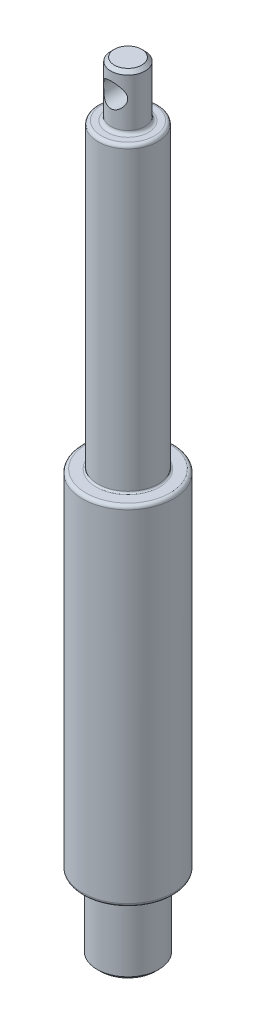
ISO-10303-21;
HEADER;
FILE_DESCRIPTION(('STEP AP214'),'2;1');
FILE_NAME('part.step','',(''),(''),'','','');
FILE_SCHEMA(('AUTOMOTIVE_DESIGN { 1 0 10303 214 1 1 1 1 }'));
ENDSEC;
DATA;
#1=APPLICATION_CONTEXT('core data for automotive mechanical design processes');
#2=APPLICATION_PROTOCOL_DEFINITION('international standard','automotive_design',2000,#1);
#3=PRODUCT_CONTEXT('',#1,'mechanical');
#4=PRODUCT('Part','Part','',(#3));
#5=PRODUCT_RELATED_PRODUCT_CATEGORY('part','',(#4));
#6=PRODUCT_DEFINITION_FORMATION('','',#4);
#7=PRODUCT_DEFINITION_CONTEXT('part definition',#1,'design');
#8=PRODUCT_DEFINITION('design','',#6,#7);
#9=PRODUCT_DEFINITION_SHAPE('','',#8);
#10=(LENGTH_UNIT() NAMED_UNIT(*) SI_UNIT(.MILLI.,.METRE.));
#11=(NAMED_UNIT(*) PLANE_ANGLE_UNIT() SI_UNIT($,.RADIAN.));
#12=(NAMED_UNIT(*) SI_UNIT($,.STERADIAN.) SOLID_ANGLE_UNIT());
#13=UNCERTAINTY_MEASURE_WITH_UNIT(LENGTH_MEASURE(1.E-05),#10,'distance_accuracy_value','');
#14=(GEOMETRIC_REPRESENTATION_CONTEXT(3) GLOBAL_UNCERTAINTY_ASSIGNED_CONTEXT((#13)) GLOBAL_UNIT_ASSIGNED_CONTEXT((#10,
#11,#12)) REPRESENTATION_CONTEXT('',''));
#15=CARTESIAN_POINT('',(0.,0.,0.));
#16=DIRECTION('',(0.,0.,1.));
#17=DIRECTION('',(1.,0.,0.));
#18=AXIS2_PLACEMENT_3D('',#15,#16,#17);
#19=CARTESIAN_POINT('',(0.,0.,0.));
#20=DIRECTION('',(0.,1.,0.));
#21=DIRECTION('',(0.,0.,1.));
#22=AXIS2_PLACEMENT_3D('',#19,#20,#21);
#23=PLANE('',#22);
#24=CARTESIAN_POINT('',(0.,0.,0.));
#25=DIRECTION('',(0.,-1.,0.));
#26=DIRECTION('',(0.,0.,-1.));
#27=AXIS2_PLACEMENT_3D('',#24,#25,#26);
#28=CIRCLE('',#27,5.125);
#29=CARTESIAN_POINT('',(0.,0.,-5.125));
#30=VERTEX_POINT('',#29);
#31=EDGE_CURVE('E70',#30,#30,#28,.T.);
#32=ORIENTED_EDGE('',*,*,#31,.F.);
#33=EDGE_LOOP('',(#32));
#34=FACE_BOUND('',#33,.T.);
#35=CARTESIAN_POINT('',(0.,0.,0.));
#36=DIRECTION('',(0.,1.,0.));
#37=DIRECTION('',(0.,0.,1.));
#38=AXIS2_PLACEMENT_3D('',#35,#36,#37);
#39=CIRCLE('',#38,8.00000000000004);
#40=CARTESIAN_POINT('',(0.,0.,8.00000000000004));
#41=VERTEX_POINT('',#40);
#42=EDGE_CURVE('E148',#41,#41,#39,.F.);
#43=ORIENTED_EDGE('',*,*,#42,.T.);
#44=EDGE_LOOP('',(#43));
#45=FACE_BOUND('',#44,.T.);
#46=ADVANCED_FACE('F49',(#34,#45),#23,.F.);
#47=CARTESIAN_POINT('',(0.,227.,0.));
#48=DIRECTION('',(0.,1.,0.));
#49=DIRECTION('',(0.,0.,1.));
#50=AXIS2_PLACEMENT_3D('',#47,#48,#49);
#51=CYLINDRICAL_SURFACE('',#50,9.);
#52=CARTESIAN_POINT('',(0.,0.999999999999973,0.));
#53=DIRECTION('',(0.,1.,0.));
#54=DIRECTION('',(0.,0.,1.));
#55=AXIS2_PLACEMENT_3D('',#52,#53,#54);
#56=CIRCLE('',#55,9.);
#57=CARTESIAN_POINT('',(0.,0.999999999999973,9.));
#58=VERTEX_POINT('',#57);
#59=EDGE_CURVE('E151',#58,#58,#56,.T.);
#60=ORIENTED_EDGE('',*,*,#59,.T.);
#61=EDGE_LOOP('',(#60));
#62=FACE_BOUND('',#61,.T.);
#63=CARTESIAN_POINT('',(0.,20.5,0.));
#64=DIRECTION('',(0.,1.,0.));
#65=DIRECTION('',(0.,0.,1.));
#66=AXIS2_PLACEMENT_3D('',#63,#64,#65);
#67=CIRCLE('',#66,9.);
#68=CARTESIAN_POINT('',(0.,20.5,9.));
#69=VERTEX_POINT('',#68);
#70=EDGE_CURVE('E200',#69,#69,#67,.F.);
#71=ORIENTED_EDGE('',*,*,#70,.T.);
#72=EDGE_LOOP('',(#71));
#73=FACE_BOUND('',#72,.T.);
#74=ADVANCED_FACE('F106',(#62,#73),#51,.T.);
#75=CARTESIAN_POINT('',(0.,21.5,-9.));
#76=DIRECTION('',(0.,1.,0.));
#77=DIRECTION('',(0.,0.,1.));
#78=AXIS2_PLACEMENT_3D('',#75,#76,#77);
#79=PLANE('',#78);
#80=CARTESIAN_POINT('',(0.,21.5,0.));
#81=DIRECTION('',(0.,1.,0.));
#82=DIRECTION('',(0.,0.,1.));
#83=AXIS2_PLACEMENT_3D('',#80,#81,#82);
#84=CIRCLE('',#83,12.25);
#85=CARTESIAN_POINT('',(0.,21.5,12.25));
#86=VERTEX_POINT('',#85);
#87=EDGE_CURVE('E197',#86,#86,#84,.F.);
#88=ORIENTED_EDGE('',*,*,#87,.T.);
#89=EDGE_LOOP('',(#88));
#90=FACE_BOUND('',#89,.T.);
#91=CARTESIAN_POINT('',(0.,21.5,0.));
#92=DIRECTION('',(0.,1.,0.));
#93=DIRECTION('',(0.,0.,1.));
#94=AXIS2_PLACEMENT_3D('',#91,#92,#93);
#95=CIRCLE('',#94,10.);
#96=CARTESIAN_POINT('',(0.,21.5,10.));
#97=VERTEX_POINT('',#96);
#98=EDGE_CURVE('E194',#97,#97,#95,.T.);
#99=ORIENTED_EDGE('',*,*,#98,.T.);
#100=EDGE_LOOP('',(#99));
#101=FACE_BOUND('',#100,.T.);
#102=ADVANCED_FACE('F112',(#90,#101),#79,.F.);
#103=CARTESIAN_POINT('',(0.,227.,0.));
#104=DIRECTION('',(0.,1.,0.));
#105=DIRECTION('',(0.,0.,1.));
#106=AXIS2_PLACEMENT_3D('',#103,#104,#105);
#107=CYLINDRICAL_SURFACE('',#106,13.25);
#108=CARTESIAN_POINT('',(0.,122.,0.));
#109=DIRECTION('',(0.,-1.,0.));
#110=DIRECTION('',(0.,0.,-1.));
#111=AXIS2_PLACEMENT_3D('',#108,#109,#110);
#112=CIRCLE('',#111,13.25);
#113=CARTESIAN_POINT('',(0.,122.,-13.25));
#114=VERTEX_POINT('',#113);
#115=EDGE_CURVE('E185',#114,#114,#112,.T.);
#116=ORIENTED_EDGE('',*,*,#115,.T.);
#117=EDGE_LOOP('',(#116));
#118=FACE_BOUND('',#117,.T.);
#119=CARTESIAN_POINT('',(0.,22.5,0.));
#120=DIRECTION('',(0.,1.,0.));
#121=DIRECTION('',(0.,0.,1.));
#122=AXIS2_PLACEMENT_3D('',#119,#120,#121);
#123=CIRCLE('',#122,13.25);
#124=CARTESIAN_POINT('',(0.,22.5,13.25));
#125=VERTEX_POINT('',#124);
#126=EDGE_CURVE('E181',#125,#125,#123,.T.);
#127=ORIENTED_EDGE('',*,*,#126,.T.);
#128=EDGE_LOOP('',(#127));
#129=FACE_BOUND('',#128,.T.);
#130=ADVANCED_FACE('F175',(#118,#129),#107,.T.);
#131=CARTESIAN_POINT('',(0.,123.,-13.25));
#132=DIRECTION('',(0.,-1.,0.));
#133=DIRECTION('',(0.,0.,-1.));
#134=AXIS2_PLACEMENT_3D('',#131,#132,#133);
#135=PLANE('',#134);
#136=CARTESIAN_POINT('',(0.,123.,0.));
#137=DIRECTION('',(0.,-1.,0.));
#138=DIRECTION('',(0.,0.,-1.));
#139=AXIS2_PLACEMENT_3D('',#136,#137,#138);
#140=CIRCLE('',#139,9.25000000000002);
#141=CARTESIAN_POINT('',(0.,123.,-9.25000000000002));
#142=VERTEX_POINT('',#141);
#143=EDGE_CURVE('E13',#142,#142,#140,.T.);
#144=ORIENTED_EDGE('',*,*,#143,.T.);
#145=EDGE_LOOP('',(#144));
#146=FACE_BOUND('',#145,.T.);
#147=CARTESIAN_POINT('',(0.,123.,0.));
#148=DIRECTION('',(0.,-1.,0.));
#149=DIRECTION('',(0.,0.,-1.));
#150=AXIS2_PLACEMENT_3D('',#147,#148,#149);
#151=CIRCLE('',#150,12.25);
#152=CARTESIAN_POINT('',(0.,123.,-12.25));
#153=VERTEX_POINT('',#152);
#154=EDGE_CURVE('E179',#153,#153,#151,.F.);
#155=ORIENTED_EDGE('',*,*,#154,.T.);
#156=EDGE_LOOP('',(#155));
#157=FACE_BOUND('',#156,.T.);
#158=ADVANCED_FACE('F172',(#146,#157),#135,.F.);
#159=CARTESIAN_POINT('',(0.,227.,0.));
#160=DIRECTION('',(0.,1.,0.));
#161=DIRECTION('',(0.,0.,1.));
#162=AXIS2_PLACEMENT_3D('',#159,#160,#161);
#163=CYLINDRICAL_SURFACE('',#162,8.75000000000001);
#164=CARTESIAN_POINT('',(0.,123.5,0.));
#165=DIRECTION('',(0.,-1.,0.));
#166=DIRECTION('',(0.,0.,-1.));
#167=AXIS2_PLACEMENT_3D('',#164,#165,#166);
#168=CIRCLE('',#167,8.75000000000001);
#169=CARTESIAN_POINT('',(0.,123.5,-8.75000000000001));
#170=VERTEX_POINT('',#169);
#171=EDGE_CURVE('E56',#170,#170,#168,.F.);
#172=ORIENTED_EDGE('',*,*,#171,.T.);
#173=EDGE_LOOP('',(#172));
#174=FACE_BOUND('',#173,.T.);
#175=CARTESIAN_POINT('',(0.,210.,0.));
#176=DIRECTION('',(0.,-1.,0.));
#177=DIRECTION('',(0.,0.,-1.));
#178=AXIS2_PLACEMENT_3D('',#175,#176,#177);
#179=CIRCLE('',#178,8.75000000000001);
#180=CARTESIAN_POINT('',(0.,210.,-8.75000000000001));
#181=VERTEX_POINT('',#180);
#182=EDGE_CURVE('E182',#181,#181,#179,.T.);
#183=ORIENTED_EDGE('',*,*,#182,.T.);
#184=EDGE_LOOP('',(#183));
#185=FACE_BOUND('',#184,.T.);
#186=ADVANCED_FACE('F162',(#174,#185),#163,.T.);
#187=CARTESIAN_POINT('',(0.,211.,-8.75000000000001));
#188=DIRECTION('',(0.,-1.,0.));
#189=DIRECTION('',(0.,0.,-1.));
#190=AXIS2_PLACEMENT_3D('',#187,#188,#189);
#191=PLANE('',#190);
#192=CARTESIAN_POINT('',(0.,211.,0.));
#193=DIRECTION('',(0.,-1.,0.));
#194=DIRECTION('',(0.,0.,-1.));
#195=AXIS2_PLACEMENT_3D('',#192,#193,#194);
#196=CIRCLE('',#195,6.);
#197=CARTESIAN_POINT('',(0.,211.,-6.));
#198=VERTEX_POINT('',#197);
#199=EDGE_CURVE('E152',#198,#198,#196,.T.);
#200=ORIENTED_EDGE('',*,*,#199,.T.);
#201=EDGE_LOOP('',(#200));
#202=FACE_BOUND('',#201,.T.);
#203=CARTESIAN_POINT('',(0.,211.,0.));
#204=DIRECTION('',(0.,-1.,0.));
#205=DIRECTION('',(0.,0.,-1.));
#206=AXIS2_PLACEMENT_3D('',#203,#204,#205);
#207=CIRCLE('',#206,7.75000000000002);
#208=CARTESIAN_POINT('',(0.,211.,-7.75000000000002));
#209=VERTEX_POINT('',#208);
#210=EDGE_CURVE('E188',#209,#209,#207,.F.);
#211=ORIENTED_EDGE('',*,*,#210,.T.);
#212=EDGE_LOOP('',(#211));
#213=FACE_BOUND('',#212,.T.);
#214=ADVANCED_FACE('F102',(#202,#213),#191,.F.);
#215=CARTESIAN_POINT('',(0.,227.,0.));
#216=DIRECTION('',(0.,1.,0.));
#217=DIRECTION('',(0.,0.,1.));
#218=AXIS2_PLACEMENT_3D('',#215,#216,#217);
#219=CYLINDRICAL_SURFACE('',#218,5.);
#220=CARTESIAN_POINT('',(0.,212.,0.));
#221=DIRECTION('',(0.,-1.,0.));
#222=DIRECTION('',(0.,0.,-1.));
#223=AXIS2_PLACEMENT_3D('',#220,#221,#222);
#224=CIRCLE('',#223,5.);
#225=CARTESIAN_POINT('',(0.,212.,-5.));
#226=VERTEX_POINT('',#225);
#227=EDGE_CURVE('E156',#226,#226,#224,.F.);
#228=ORIENTED_EDGE('',*,*,#227,.T.);
#229=EDGE_LOOP('',(#228));
#230=FACE_BOUND('',#229,.T.);
#231=CARTESIAN_POINT('',(0.,226.,0.));
#232=DIRECTION('',(0.,-1.,0.));
#233=DIRECTION('',(0.,0.,-1.));
#234=AXIS2_PLACEMENT_3D('',#231,#232,#233);
#235=CIRCLE('',#234,5.);
#236=CARTESIAN_POINT('',(0.,226.,-5.));
#237=VERTEX_POINT('',#236);
#238=EDGE_CURVE('E209',#237,#237,#235,.T.);
#239=ORIENTED_EDGE('',*,*,#238,.T.);
#240=EDGE_LOOP('',(#239));
#241=FACE_BOUND('',#240,.T.);
#242=CARTESIAN_POINT('',(0.,216.5,5.));
#243=CARTESIAN_POINT('',(-0.0870043522183536,216.499999551234,5.00000042621704));
#244=CARTESIAN_POINT('',(-0.17400301283471,216.50324846695,4.99772447045084));
#245=CARTESIAN_POINT('',(-0.347314194586731,216.516190784067,4.98867770301692));
#246=CARTESIAN_POINT('',(-0.433626465698286,216.525886433897,4.98190532313284));
#247=CARTESIAN_POINT('',(-0.604838270775731,216.551571331186,4.96402806677404));
#248=CARTESIAN_POINT('',(-0.689738047132317,216.567559486966,4.95292394181202));
#249=CARTESIAN_POINT('',(-0.857541615637311,216.605587236717,4.92664718548648));
#250=CARTESIAN_POINT('',(-0.940444537032614,216.62762942046,4.91147281303201));
#251=CARTESIAN_POINT('',(-1.18445169780014,216.70214746913,4.86050384715948));
#252=CARTESIAN_POINT('',(-1.34188511202347,216.763174157,4.81914978198123));
#253=CARTESIAN_POINT('',(-1.64342226800416,216.905322082246,4.7248504210069));
#254=CARTESIAN_POINT('',(-1.78752406033637,216.986446252032,4.67190343382707));
#255=CARTESIAN_POINT('',(-2.0728188359913,217.174207793629,4.55294999672667));
#256=CARTESIAN_POINT('',(-2.21263077144972,217.282465722956,4.48620313255133));
#257=CARTESIAN_POINT('',(-2.47340994772193,217.517435956797,4.34787986703411));
#258=CARTESIAN_POINT('',(-2.59434841313185,217.64417588164,4.27629632500927));
#259=CARTESIAN_POINT('',(-2.7704332182586,217.85867945549,4.16301906437412));
#260=CARTESIAN_POINT('',(-2.83217300660939,217.941018306532,4.12114814248979));
#261=CARTESIAN_POINT('',(-2.94845109279401,218.111275393595,4.03877741040551));
#262=CARTESIAN_POINT('',(-3.00298752227157,218.199195068411,3.99827795794519));
#263=CARTESIAN_POINT('',(-3.15511672851824,218.470879099042,3.88091849381853));
#264=CARTESIAN_POINT('',(-3.24158145123197,218.662994400224,3.80795944870695));
#265=CARTESIAN_POINT('',(-3.3583150253545,219.003385494197,3.70483812483702));
#266=CARTESIAN_POINT('',(-3.39769929206986,219.146667143814,3.66842434173771));
#267=CARTESIAN_POINT('',(-3.45814142842494,219.440021722513,3.61151026705735));
#268=CARTESIAN_POINT('',(-3.47923517471287,219.590080746465,3.59097883101039));
#269=CARTESIAN_POINT('',(-3.5017263031474,219.893995514556,3.56906148275634));
#270=CARTESIAN_POINT('',(-3.50301074075767,220.047868023526,3.567785357308));
#271=CARTESIAN_POINT('',(-3.48547905206289,220.353393058977,3.58490716922728));
#272=CARTESIAN_POINT('',(-3.46664910102171,220.505043985886,3.60331863800168));
#273=CARTESIAN_POINT('',(-3.41217455094726,220.791827997321,3.65490422743524));
#274=CARTESIAN_POINT('',(-3.37772210034563,220.92739060296,3.68702349344459));
#275=CARTESIAN_POINT('',(-3.29410841442846,221.190787298394,3.76191452361165));
#276=CARTESIAN_POINT('',(-3.24493538684718,221.318615092975,3.80469482342136));
#277=CARTESIAN_POINT('',(-3.10362288773557,221.631130358571,3.92170358258721));
#278=CARTESIAN_POINT('',(-3.00252401271626,221.810045700101,4.00058241582139));
#279=CARTESIAN_POINT('',(-2.77217358887503,222.146324849936,4.16353835198788));
#280=CARTESIAN_POINT('',(-2.64286478640498,222.303643753395,4.24762577382758));
#281=CARTESIAN_POINT('',(-2.35615009551434,222.596341477384,4.41319719993648));
#282=CARTESIAN_POINT('',(-2.19842810008493,222.731436868213,4.4946383043019));
#283=CARTESIAN_POINT('',(-1.85792737623164,222.97347162477,4.64571074856641));
#284=CARTESIAN_POINT('',(-1.67520180814525,223.080469356795,4.71536646098568));
#285=CARTESIAN_POINT('',(-1.33103347938948,223.241300414522,4.82216631911688));
#286=CARTESIAN_POINT('',(-1.1738132378219,223.301657347756,4.86309351042244));
#287=CARTESIAN_POINT('',(-0.849391818622302,223.399584431341,4.93010011584662));
#288=CARTESIAN_POINT('',(-0.682197524634532,223.437170102043,4.95618964221846));
#289=CARTESIAN_POINT('',(-0.341601582307168,223.487556300423,4.99126408812027));
#290=CARTESIAN_POINT('',(-0.168177620339743,223.500256264493,5.00017960470658));
#291=CARTESIAN_POINT('',(0.178615477776662,223.499735953508,4.99981494790605));
#292=CARTESIAN_POINT('',(0.351984616048755,223.486516849556,4.9905355966193));
#293=CARTESIAN_POINT('',(0.681878691052509,223.436722828532,4.95588308246294));
#294=CARTESIAN_POINT('',(0.838764541823742,223.401728333682,4.93159966844544));
#295=CARTESIAN_POINT('',(1.14387617411524,223.311626699332,4.86988673925567));
#296=CARTESIAN_POINT('',(1.29210033422858,223.256515808089,4.83245477190367));
#297=CARTESIAN_POINT('',(1.58733800015483,223.123841485577,4.74402407105279));
#298=CARTESIAN_POINT('',(1.73352523808016,223.044966278017,4.6922533534956));
#299=CARTESIAN_POINT('',(2.01106205302746,222.869259458801,4.58018246824007));
#300=CARTESIAN_POINT('',(2.14240222019468,222.772416561034,4.519876945222));
#301=CARTESIAN_POINT('',(2.41023390883481,222.544939582541,4.38372102498776));
#302=CARTESIAN_POINT('',(2.54376778669954,222.411359026569,4.3069755936636));
#303=CARTESIAN_POINT('',(2.78779809474491,222.124542791527,4.15319019961225));
#304=CARTESIAN_POINT('',(2.89827626990346,221.971291691614,4.07615005231013));
#305=CARTESIAN_POINT('',(3.08500748122275,221.661977469913,3.93636847825756));
#306=CARTESIAN_POINT('',(3.16352422284574,221.507587432333,3.87296424128965));
#307=CARTESIAN_POINT('',(3.29796239328926,221.184844770458,3.75915149445727));
#308=CARTESIAN_POINT('',(3.35392797233401,221.016520213825,3.70871766214843));
#309=CARTESIAN_POINT('',(3.43149310287238,220.703765430281,3.63690600243932));
#310=CARTESIAN_POINT('',(3.45775440021169,220.561389757365,3.61171423380861));
#311=CARTESIAN_POINT('',(3.49238830513131,220.272586577634,3.57824517387987));
#312=CARTESIAN_POINT('',(3.50078409856962,220.1261645726,3.56994596002657));
#313=CARTESIAN_POINT('',(3.49909888334034,219.833359819039,3.5715971669588));
#314=CARTESIAN_POINT('',(3.48899567350593,219.686977328825,3.58156951596319));
#315=CARTESIAN_POINT('',(3.45102053266416,219.398596490882,3.61816485082621));
#316=CARTESIAN_POINT('',(3.423122652766,219.256604863651,3.64481215168135));
#317=CARTESIAN_POINT('',(3.34096227925003,218.94095420405,3.72046646887594));
#318=CARTESIAN_POINT('',(3.28147777563184,218.769682927103,3.77366378114441));
#319=CARTESIAN_POINT('',(3.13919427182781,218.441953609031,3.89281979106869));
#320=CARTESIAN_POINT('',(3.05635903921874,218.28551909772,3.9587982706026));
#321=CARTESIAN_POINT('',(2.86739904025202,217.984989333815,4.09782005745645));
#322=CARTESIAN_POINT('',(2.76076710805697,217.841276157868,4.17099409346803));
#323=CARTESIAN_POINT('',(2.52666411670153,217.571451120145,4.31682488642122));
#324=CARTESIAN_POINT('',(2.39918616499739,217.445345105667,4.38948146395007));
#325=CARTESIAN_POINT('',(2.1805868718608,217.2602189874,4.50037637833513));
#326=CARTESIAN_POINT('',(2.09580486228948,217.194794744978,4.54058015716475));
#327=CARTESIAN_POINT('',(1.91963184498296,217.071422205706,4.61781861454204));
#328=CARTESIAN_POINT('',(1.828243707966,217.01347069167,4.6548546545483));
#329=CARTESIAN_POINT('',(1.63930910148055,216.905733511123,4.72470170576157));
#330=CARTESIAN_POINT('',(1.54176605451251,216.855943360864,4.75751503472721));
#331=CARTESIAN_POINT('',(1.34109196004975,216.765253485465,4.81792906327281));
#332=CARTESIAN_POINT('',(1.23796250088346,216.724351249715,4.84553123458173));
#333=CARTESIAN_POINT('',(1.04286308882538,216.657634301868,4.89090028372526));
#334=CARTESIAN_POINT('',(0.951550304698931,216.630475256402,4.90952223595849));
#335=CARTESIAN_POINT('',(0.766197984404925,216.583558282031,4.94184014789706));
#336=CARTESIAN_POINT('',(0.672159051937679,216.56379872781,4.95553718934474));
#337=CARTESIAN_POINT('',(0.482256943579317,216.532048628417,4.97760550276437));
#338=CARTESIAN_POINT('',(0.386395698505606,216.520050285861,4.98598211980299));
#339=CARTESIAN_POINT('',(0.193687228275436,216.504026563862,4.99717889255552));
#340=CARTESIAN_POINT('',(0.0968400885386123,216.500000499499,4.99999952559964));
#341=CARTESIAN_POINT('',(0.,216.5,5.));
#342=B_SPLINE_CURVE_WITH_KNOTS('',3,(#242,#243,#244,#245,#246,#247,#248,#249,#250,#251,#252,
#253,#254,#255,#256,#257,#258,#259,#260,#261,#262,#263,#264,#265,#266,#267,#268,#269,#270,#271,
#272,#273,#274,#275,#276,#277,#278,#279,#280,#281,#282,#283,#284,#285,#286,#287,#288,#289,#290,
#291,#292,#293,#294,#295,#296,#297,#298,#299,#300,#301,#302,#303,#304,#305,#306,#307,#308,#309,
#310,#311,#312,#313,#314,#315,#316,#317,#318,#319,#320,#321,#322,#323,#324,#325,#326,#327,#328,
#329,#330,#331,#332,#333,#334,#335,#336,#337,#338,#339,#340,#341),.UNSPECIFIED.,.T.,.F.,(4,2,2,
2,2,2,2,2,2,2,2,2,2,2,2,2,2,2,2,2,2,2,2,2,2,2,2,2,2,2,2,2,2,2,2,2,2,2,2,2,2,2,2,2,2,2,2,2,2,4),
(0.,0.26091318666607,0.521917419774393,0.782876391488199,1.04394716964422,1.56298190958994,
2.08209242616793,2.647052375925,3.21286544833364,3.54582584040705,3.8788724245109,
4.54318175364802,5.00048193722639,5.45688308933273,5.91588549736319,6.37520358351763,
6.80419814677743,7.23353729006893,7.89043125944824,8.5486710452667,9.21474554480333,
9.87942528554165,10.3971938189048,10.9146090554215,11.4341108995648,11.9535892715581,
12.4391680706141,12.9248374772988,13.4448388396,13.9651679449171,14.5744472504111,
15.1842071553652,15.7356049750208,16.2859179716954,16.7249070607091,17.1633260811638,
17.6022716053508,18.041858685169,18.6056470200952,19.1703150249753,19.7484161780974,
20.326708862948,20.6694660014281,21.0120750786387,21.3544952953891,21.6968186610906,
21.9876091670433,22.2783357626329,22.5687698211747,22.8591789266206),.UNSPECIFIED.);
#343=CARTESIAN_POINT('',(0.,216.5,5.));
#344=VERTEX_POINT('',#343);
#345=EDGE_CURVE('E73',#344,#344,#342,.T.);
#346=ORIENTED_EDGE('',*,*,#345,.T.);
#347=EDGE_LOOP('',(#346));
#348=FACE_BOUND('',#347,.T.);
#349=CARTESIAN_POINT('',(3.50000000000001,220.,-3.57071421427142));
#350=CARTESIAN_POINT('',(3.49999986805822,220.084011677932,-3.57071444227762));
#351=CARTESIAN_POINT('',(3.49696837280136,220.16802807914,-3.57369340485415));
#352=CARTESIAN_POINT('',(3.48491820858273,220.335221129012,-3.58544479584589));
#353=CARTESIAN_POINT('',(3.47589877899899,220.41839766963,-3.59421796027333));
#354=CARTESIAN_POINT('',(3.45205902368666,220.583301238778,-3.61712038134413));
#355=CARTESIAN_POINT('',(3.43722907172256,220.665025625457,-3.63125852486516));
#356=CARTESIAN_POINT('',(3.4020589996042,220.826329023077,-3.66422903125624));
#357=CARTESIAN_POINT('',(3.38171588997805,220.905906844242,-3.68306394047143));
#358=CARTESIAN_POINT('',(3.31343273469923,221.138916107776,-3.74498377926853));
#359=CARTESIAN_POINT('',(3.25792983356844,221.288669203096,-3.79380187047574));
#360=CARTESIAN_POINT('',(3.12892878038647,221.576297996484,-3.90087401896263));
#361=CARTESIAN_POINT('',(3.05542937508973,221.714172866468,-3.95912873329684));
#362=CARTESIAN_POINT('',(2.8775800199573,222.000680578572,-4.09069829259001));
#363=CARTESIAN_POINT('',(2.77008151456321,222.146969032115,-4.16486395322641));
#364=CARTESIAN_POINT('',(2.53353397098198,222.421582463303,-4.31285170621028));
#365=CARTESIAN_POINT('',(2.40445840102963,222.549884963352,-4.38667325913046));
#366=CARTESIAN_POINT('',(2.18404386347784,222.737025647243,-4.49869833464922));
#367=CARTESIAN_POINT('',(2.099342759051,222.802558010897,-4.53894407009187));
#368=CARTESIAN_POINT('',(1.92332930388742,222.926151222306,-4.61627900113463));
#369=CARTESIAN_POINT('',(1.83201995786278,222.984215432828,-4.65336961485968));
#370=CARTESIAN_POINT('',(1.64329666492624,223.092146505864,-4.7233128690014));
#371=CARTESIAN_POINT('',(1.54589087811428,223.142024015347,-4.75617100167412));
#372=CARTESIAN_POINT('',(1.34554036564387,223.232897580659,-4.81668778515884));
#373=CARTESIAN_POINT('',(1.2425980762348,223.27389750365,-4.84434869923231));
#374=CARTESIAN_POINT('',(0.983360292526823,223.362946649688,-4.90488399105479));
#375=CARTESIAN_POINT('',(0.824311147516167,223.405558343499,-4.93430046232691));
#376=CARTESIAN_POINT('',(0.499863083697408,223.468055162245,-4.97763994451799));
#377=CARTESIAN_POINT('',(0.334469344205575,223.487958433292,-4.99157532601281));
#378=CARTESIAN_POINT('',(0.001617447457918,223.503968748193,-5.00277536324989));
#379=CARTESIAN_POINT('',(-0.165844090878691,223.50002957618,-5.00000764195533));
#380=CARTESIAN_POINT('',(-0.497418219515107,223.468476943845,-4.9779722699754));
#381=CARTESIAN_POINT('',(-0.661529862861109,223.440856881716,-4.95870001812473));
#382=CARTESIAN_POINT('',(-0.978182973341588,223.364387765373,-4.90595172527039));
#383=CARTESIAN_POINT('',(-1.13090300544787,223.316037512871,-4.87280983262962));
#384=CARTESIAN_POINT('',(-1.42573235226605,223.200373743242,-4.79484839778881));
#385=CARTESIAN_POINT('',(-1.56783957555519,223.133056500777,-4.75002656164198));
#386=CARTESIAN_POINT('',(-1.8547298650338,222.97319649242,-4.64605138757533));
#387=CARTESIAN_POINT('',(-1.99802306089553,222.878670475867,-4.58585414417231));
#388=CARTESIAN_POINT('',(-2.26760327144738,222.671503583089,-4.45872611615664));
#389=CARTESIAN_POINT('',(-2.39387169821939,222.558843197107,-4.3917881089011));
#390=CARTESIAN_POINT('',(-2.64933768852687,222.295737672511,-4.24340806485978));
#391=CARTESIAN_POINT('',(-2.77503109679522,222.142137789905,-4.16151070369984));
#392=CARTESIAN_POINT('',(-2.99972519148242,221.814147061663,-4.00256853562556));
#393=CARTESIAN_POINT('',(-3.09873277519885,221.639761605166,-3.9255224787818));
#394=CARTESIAN_POINT('',(-3.24758768225955,221.314289045191,-3.8026620913221));
#395=CARTESIAN_POINT('',(-3.30350993621508,221.167160499259,-3.75374718450966));
#396=CARTESIAN_POINT('',(-3.39566741502561,220.862869886422,-3.67060616067577));
#397=CARTESIAN_POINT('',(-3.4319394578135,220.705727204705,-3.63635259865795));
#398=CARTESIAN_POINT('',(-3.47003079615615,220.464387907698,-3.59988592145285));
#399=CARTESIAN_POINT('',(-3.48001777086798,220.38252178737,-3.59020430967993));
#400=CARTESIAN_POINT('',(-3.49418953353765,220.217838512661,-3.57641501090518));
#401=CARTESIAN_POINT('',(-3.49837722640208,220.13502185539,-3.57230453329974));
#402=CARTESIAN_POINT('',(-3.50084655748582,219.969220281175,-3.56988465651078));
#403=CARTESIAN_POINT('',(-3.49912858397159,219.886235375652,-3.57157487596197));
#404=CARTESIAN_POINT('',(-3.48984003419737,219.720931767457,-3.5806497895567));
#405=CARTESIAN_POINT('',(-3.48226970500183,219.63861303681,-3.58803424331106));
#406=CARTESIAN_POINT('',(-3.4539187383549,219.416525821061,-3.61539718295496));
#407=CARTESIAN_POINT('',(-3.42755118460911,219.278066299512,-3.64061523125558));
#408=CARTESIAN_POINT('',(-3.35939166417161,219.008047197967,-3.70359382721181));
#409=CARTESIAN_POINT('',(-3.31758343584067,218.876495060051,-3.74136759395143));
#410=CARTESIAN_POINT('',(-3.1970570220598,218.561554145915,-3.8454859533184));
#411=CARTESIAN_POINT('',(-3.11022921638748,218.382939513528,-3.91690709544713));
#412=CARTESIAN_POINT('',(-2.90985386221773,218.045142208682,-4.0679911437822));
#413=CARTESIAN_POINT('',(-2.79625408887281,217.885998452298,-4.14766998612658));
#414=CARTESIAN_POINT('',(-2.54184750044464,217.585791842362,-4.30837399504845));
#415=CARTESIAN_POINT('',(-2.40056769357133,217.44512689033,-4.38939619169588));
#416=CARTESIAN_POINT('',(-2.09383690527273,217.188279453042,-4.54370670629866));
#417=CARTESIAN_POINT('',(-1.9284219784284,217.072061069464,-4.61700628432376));
#418=CARTESIAN_POINT('',(-1.60391474590196,216.884454498129,-4.73839524822717));
#419=CARTESIAN_POINT('',(-1.448095898033,216.808860565768,-4.78864360221707));
#420=CARTESIAN_POINT('',(-1.20483682926393,216.712752545492,-4.85339532505929));
#421=CARTESIAN_POINT('',(-1.12213837140324,216.683591476259,-4.87321301651713));
#422=CARTESIAN_POINT('',(-0.954017953537522,216.631382351487,-4.9088918145644));
#423=CARTESIAN_POINT('',(-0.868597174673461,216.608331684195,-4.92475461141138));
#424=CARTESIAN_POINT('',(-0.695045998305538,216.568544371939,-4.95223988843495));
#425=CARTESIAN_POINT('',(-0.606901942141621,216.551848332975,-4.96383508366238));
#426=CARTESIAN_POINT('',(-0.429146661764354,216.525247414321,-4.98235028019359));
#427=CARTESIAN_POINT('',(-0.339536115360885,216.515339483152,-4.98927238218753));
#428=CARTESIAN_POINT('',(-0.15957463853191,216.502476871445,-4.99826427408952));
#429=CARTESIAN_POINT('',(-0.0692237695715061,216.499521619416,-5.00033446281117));
#430=CARTESIAN_POINT('',(0.111386213674441,216.500605358443,-4.99957665306816));
#431=CARTESIAN_POINT('',(0.201645334343159,216.504643824071,-4.99674902256968));
#432=CARTESIAN_POINT('',(0.453706070640161,216.525728280514,-4.98201193742932));
#433=CARTESIAN_POINT('',(0.614624206362638,216.550626981103,-4.96462490953326));
#434=CARTESIAN_POINT('',(0.929254385269894,216.621749792411,-4.91547827454332));
#435=CARTESIAN_POINT('',(1.0829650514795,216.66797795995,-4.88371593331677));
#436=CARTESIAN_POINT('',(1.38525152946053,216.781606963154,-4.80689474829355));
#437=CARTESIAN_POINT('',(1.53345914358806,216.849692418247,-4.76140930888082));
#438=CARTESIAN_POINT('',(1.81648395037298,217.003936190244,-4.6607922006303));
#439=CARTESIAN_POINT('',(1.95129854538513,217.090098003107,-4.60565866619875));
#440=CARTESIAN_POINT('',(2.22620599551138,217.293045720298,-4.47998570352174));
#441=CARTESIAN_POINT('',(2.3638274162244,217.412513558151,-4.40838537577143));
#442=CARTESIAN_POINT('',(2.61851490693398,217.670549871832,-4.26203935440105));
#443=CARTESIAN_POINT('',(2.73553705055281,217.809158066988,-4.18728735064931));
#444=CARTESIAN_POINT('',(2.90279164002685,218.04173189139,-4.0717779019235));
#445=CARTESIAN_POINT('',(2.96040527554759,218.1299337252,-4.02995435750539));
#446=CARTESIAN_POINT('',(3.06787708455976,218.312003346441,-3.94875555037809));
#447=CARTESIAN_POINT('',(3.11773307147628,218.405872721017,-3.90938097980841));
#448=CARTESIAN_POINT('',(3.25469370743704,218.695274700702,-3.79747094334632));
#449=CARTESIAN_POINT('',(3.3297078953953,218.899311662511,-3.73077213202404));
#450=CARTESIAN_POINT('',(3.42286407941505,219.254582801173,-3.64508796183998));
#451=CARTESIAN_POINT('',(3.45160892505022,219.400976685065,-3.61761863156992));
#452=CARTESIAN_POINT('',(3.48054616594461,219.623928119285,-3.5897009561624));
#453=CARTESIAN_POINT('',(3.48782851362815,219.698782001633,-3.58260959032748));
#454=CARTESIAN_POINT('',(3.49755478092014,219.849089440708,-3.57311680421739));
#455=CARTESIAN_POINT('',(3.50000011850682,219.924542815178,-3.57071400948196));
#456=CARTESIAN_POINT('',(3.50000000000001,220.,-3.57071421427142));
#457=B_SPLINE_CURVE_WITH_KNOTS('',3,(#349,#350,#351,#352,#353,#354,#355,#356,#357,#358,#359,
#360,#361,#362,#363,#364,#365,#366,#367,#368,#369,#370,#371,#372,#373,#374,#375,#376,#377,#378,
#379,#380,#381,#382,#383,#384,#385,#386,#387,#388,#389,#390,#391,#392,#393,#394,#395,#396,#397,
#398,#399,#400,#401,#402,#403,#404,#405,#406,#407,#408,#409,#410,#411,#412,#413,#414,#415,#416,
#417,#418,#419,#420,#421,#422,#423,#424,#425,#426,#427,#428,#429,#430,#431,#432,#433,#434,#435,
#436,#437,#438,#439,#440,#441,#442,#443,#444,#445,#446,#447,#448,#449,#450,#451,#452,#453,#454,
#455,#456),.UNSPECIFIED.,.T.,.F.,(4,2,2,2,2,2,2,2,2,2,2,2,2,2,2,2,2,2,2,2,2,2,2,2,2,2,2,2,2,2,2,
2,2,2,2,2,2,2,2,2,2,2,2,2,2,2,2,2,2,2,2,2,2,4),(0.,0.251937866412448,0.503907741551057,
0.756296829862786,1.00882304920271,1.50767705491858,2.0065658098531,2.59282147933111,
3.17980340054552,3.52260937165973,3.86526043937809,4.20746228977046,4.54951477248529,
5.0489629508226,5.54801174411971,6.04802819620324,6.5481840892456,7.03692702754732,
7.52576602764993,8.06947174934067,8.61376637205005,9.25526677268934,9.89660120988582,
10.3893951008704,10.8812624388974,11.1300434938739,11.3786998873026,11.6273399331954,
11.8759694830138,12.303607248783,12.7316966796847,13.3614491436806,13.9924404037767,
14.6353397124454,15.2772882678786,15.8158328001981,16.0852507072975,16.3545532714236,
16.6255488849346,16.8964225968412,17.1672740429107,17.4381051411785,17.9269002736074,
18.4157884121987,18.9217932383026,19.427896015829,20.0131431134068,20.5996234731159,
20.939266740836,21.2790055678482,21.955653176671,22.4086307865933,22.6349814326882,
22.8612657138439),.UNSPECIFIED.);
#458=CARTESIAN_POINT('',(3.50000000000001,220.,-3.57071421427142));
#459=VERTEX_POINT('',#458);
#460=EDGE_CURVE('E69',#459,#459,#457,.T.);
#461=ORIENTED_EDGE('',*,*,#460,.T.);
#462=EDGE_LOOP('',(#461));
#463=FACE_BOUND('',#462,.T.);
#464=ADVANCED_FACE('F85',(#230,#241,#348,#463),#219,.T.);
#465=CARTESIAN_POINT('',(0.,227.,-5.));
#466=DIRECTION('',(0.,-1.,0.));
#467=DIRECTION('',(0.,0.,-1.));
#468=AXIS2_PLACEMENT_3D('',#465,#466,#467);
#469=PLANE('',#468);
#470=CARTESIAN_POINT('',(0.,227.,0.));
#471=DIRECTION('',(0.,-1.,0.));
#472=DIRECTION('',(0.,0.,-1.));
#473=AXIS2_PLACEMENT_3D('',#470,#471,#472);
#474=CIRCLE('',#473,4.);
#475=CARTESIAN_POINT('',(0.,227.,-4.));
#476=VERTEX_POINT('',#475);
#477=EDGE_CURVE('E215',#476,#476,#474,.F.);
#478=ORIENTED_EDGE('',*,*,#477,.T.);
#479=EDGE_LOOP('',(#478));
#480=FACE_BOUND('',#479,.T.);
#481=ADVANCED_FACE('F93',(#480),#469,.F.);
#482=CARTESIAN_POINT('',(0.,220.,-13.25));
#483=DIRECTION('',(0.,0.,1.));
#484=DIRECTION('',(1.,0.,0.));
#485=AXIS2_PLACEMENT_3D('',#482,#483,#484);
#486=CYLINDRICAL_SURFACE('',#485,3.5);
#487=ORIENTED_EDGE('',*,*,#460,.F.);
#488=EDGE_LOOP('',(#487));
#489=FACE_BOUND('',#488,.T.);
#490=ORIENTED_EDGE('',*,*,#345,.F.);
#491=EDGE_LOOP('',(#490));
#492=FACE_BOUND('',#491,.T.);
#493=ADVANCED_FACE('F89',(#489,#492),#486,.F.);
#494=CARTESIAN_POINT('',(0.,227.,0.));
#495=DIRECTION('',(0.,-1.,0.));
#496=DIRECTION('',(0.,0.,-1.));
#497=AXIS2_PLACEMENT_3D('',#494,#495,#496);
#498=CONICAL_SURFACE('',#497,4.,0.785398163397433);
#499=ORIENTED_EDGE('',*,*,#238,.F.);
#500=EDGE_LOOP('',(#499));
#501=FACE_BOUND('',#500,.T.);
#502=ORIENTED_EDGE('',*,*,#477,.F.);
#503=EDGE_LOOP('',(#502));
#504=FACE_BOUND('',#503,.T.);
#505=ADVANCED_FACE('F92',(#501,#504),#498,.T.);
#506=CARTESIAN_POINT('',(0.,210.,0.));
#507=DIRECTION('',(0.,-1.,0.));
#508=DIRECTION('',(0.,0.,-1.));
#509=AXIS2_PLACEMENT_3D('',#506,#507,#508);
#510=TOROIDAL_SURFACE('',#509,7.75000000000002,1.);
#511=ORIENTED_EDGE('',*,*,#182,.F.);
#512=EDGE_LOOP('',(#511));
#513=FACE_BOUND('',#512,.T.);
#514=ORIENTED_EDGE('',*,*,#210,.F.);
#515=EDGE_LOOP('',(#514));
#516=FACE_BOUND('',#515,.T.);
#517=ADVANCED_FACE('F121',(#513,#516),#510,.T.);
#518=CARTESIAN_POINT('',(0.,122.,0.));
#519=DIRECTION('',(0.,-1.,0.));
#520=DIRECTION('',(0.,0.,-1.));
#521=AXIS2_PLACEMENT_3D('',#518,#519,#520);
#522=TOROIDAL_SURFACE('',#521,12.25,1.);
#523=ORIENTED_EDGE('',*,*,#115,.F.);
#524=EDGE_LOOP('',(#523));
#525=FACE_BOUND('',#524,.T.);
#526=ORIENTED_EDGE('',*,*,#154,.F.);
#527=EDGE_LOOP('',(#526));
#528=FACE_BOUND('',#527,.T.);
#529=ADVANCED_FACE('F125',(#525,#528),#522,.T.);
#530=CARTESIAN_POINT('',(0.,22.5,0.));
#531=DIRECTION('',(0.,1.,0.));
#532=DIRECTION('',(0.,0.,1.));
#533=AXIS2_PLACEMENT_3D('',#530,#531,#532);
#534=TOROIDAL_SURFACE('',#533,12.25,1.);
#535=ORIENTED_EDGE('',*,*,#87,.F.);
#536=EDGE_LOOP('',(#535));
#537=FACE_BOUND('',#536,.T.);
#538=ORIENTED_EDGE('',*,*,#126,.F.);
#539=EDGE_LOOP('',(#538));
#540=FACE_BOUND('',#539,.T.);
#541=ADVANCED_FACE('F129',(#537,#540),#534,.T.);
#542=CARTESIAN_POINT('',(0.,20.5,0.));
#543=DIRECTION('',(0.,1.,0.));
#544=DIRECTION('',(0.,0.,1.));
#545=AXIS2_PLACEMENT_3D('',#542,#543,#544);
#546=TOROIDAL_SURFACE('',#545,10.,1.);
#547=ORIENTED_EDGE('',*,*,#70,.F.);
#548=EDGE_LOOP('',(#547));
#549=FACE_BOUND('',#548,.T.);
#550=ORIENTED_EDGE('',*,*,#98,.F.);
#551=EDGE_LOOP('',(#550));
#552=FACE_BOUND('',#551,.T.);
#553=ADVANCED_FACE('F133',(#549,#552),#546,.F.);
#554=CARTESIAN_POINT('',(0.,212.,0.));
#555=DIRECTION('',(0.,-1.,0.));
#556=DIRECTION('',(0.,0.,-1.));
#557=AXIS2_PLACEMENT_3D('',#554,#555,#556);
#558=TOROIDAL_SURFACE('',#557,6.,1.);
#559=ORIENTED_EDGE('',*,*,#199,.F.);
#560=EDGE_LOOP('',(#559));
#561=FACE_BOUND('',#560,.T.);
#562=ORIENTED_EDGE('',*,*,#227,.F.);
#563=EDGE_LOOP('',(#562));
#564=FACE_BOUND('',#563,.T.);
#565=ADVANCED_FACE('F137',(#561,#564),#558,.F.);
#566=CARTESIAN_POINT('',(0.,0.999999999999973,0.));
#567=DIRECTION('',(0.,1.,0.));
#568=DIRECTION('',(0.,0.,1.));
#569=AXIS2_PLACEMENT_3D('',#566,#567,#568);
#570=CONICAL_SURFACE('',#569,9.,0.785398163397444);
#571=ORIENTED_EDGE('',*,*,#42,.F.);
#572=EDGE_LOOP('',(#571));
#573=FACE_BOUND('',#572,.T.);
#574=ORIENTED_EDGE('',*,*,#59,.F.);
#575=EDGE_LOOP('',(#574));
#576=FACE_BOUND('',#575,.T.);
#577=ADVANCED_FACE('F63',(#573,#576),#570,.T.);
#578=CARTESIAN_POINT('',(0.,15.,0.));
#579=DIRECTION('',(0.,-1.,0.));
#580=DIRECTION('',(0.,0.,-1.));
#581=AXIS2_PLACEMENT_3D('',#578,#579,#580);
#582=CONICAL_SURFACE('',#581,5.125,1.02974425867665);
#583=CARTESIAN_POINT('',(0.,18.0794106725162,0.));
#584=VERTEX_POINT('',#583);
#585=VERTEX_LOOP('',#584);
#586=FACE_BOUND('',#585,.T.);
#587=CARTESIAN_POINT('',(0.,15.,0.));
#588=DIRECTION('',(0.,-1.,0.));
#589=DIRECTION('',(0.,0.,-1.));
#590=AXIS2_PLACEMENT_3D('',#587,#588,#589);
#591=CIRCLE('',#590,5.125);
#592=CARTESIAN_POINT('',(0.,15.,-5.125));
#593=VERTEX_POINT('',#592);
#594=EDGE_CURVE('E67',#593,#593,#591,.T.);
#595=ORIENTED_EDGE('',*,*,#594,.T.);
#596=EDGE_LOOP('',(#595));
#597=FACE_BOUND('',#596,.T.);
#598=ADVANCED_FACE('F59',(#586,#597),#582,.F.);
#599=CARTESIAN_POINT('',(0.,0.,0.));
#600=DIRECTION('',(0.,-1.,0.));
#601=DIRECTION('',(0.,0.,-1.));
#602=AXIS2_PLACEMENT_3D('',#599,#600,#601);
#603=CYLINDRICAL_SURFACE('',#602,5.125);
#604=ORIENTED_EDGE('',*,*,#594,.F.);
#605=EDGE_LOOP('',(#604));
#606=FACE_BOUND('',#605,.T.);
#607=ORIENTED_EDGE('',*,*,#31,.T.);
#608=EDGE_LOOP('',(#607));
#609=FACE_BOUND('',#608,.T.);
#610=ADVANCED_FACE('F62',(#606,#609),#603,.F.);
#611=CARTESIAN_POINT('',(0.,123.5,0.));
#612=DIRECTION('',(0.,-1.,0.));
#613=DIRECTION('',(0.,0.,-1.));
#614=AXIS2_PLACEMENT_3D('',#611,#612,#613);
#615=TOROIDAL_SURFACE('',#614,9.25000000000002,0.5);
#616=ORIENTED_EDGE('',*,*,#143,.F.);
#617=EDGE_LOOP('',(#616));
#618=FACE_BOUND('',#617,.T.);
#619=ORIENTED_EDGE('',*,*,#171,.F.);
#620=EDGE_LOOP('',(#619));
#621=FACE_BOUND('',#620,.T.);
#622=ADVANCED_FACE('F51',(#618,#621),#615,.F.);
#623=CLOSED_SHELL('',(#46,#74,#102,#130,#158,#186,#214,#464,#481,#493,#505,#517,#529,#541,#553,
#565,#577,#598,#610,#622));
#624=MANIFOLD_SOLID_BREP('B2',#623);
#625=ADVANCED_BREP_SHAPE_REPRESENTATION('',(#18,#624),#14);
#626=SHAPE_DEFINITION_REPRESENTATION(#9,#625);
ENDSEC;
END-ISO-10303-21;
